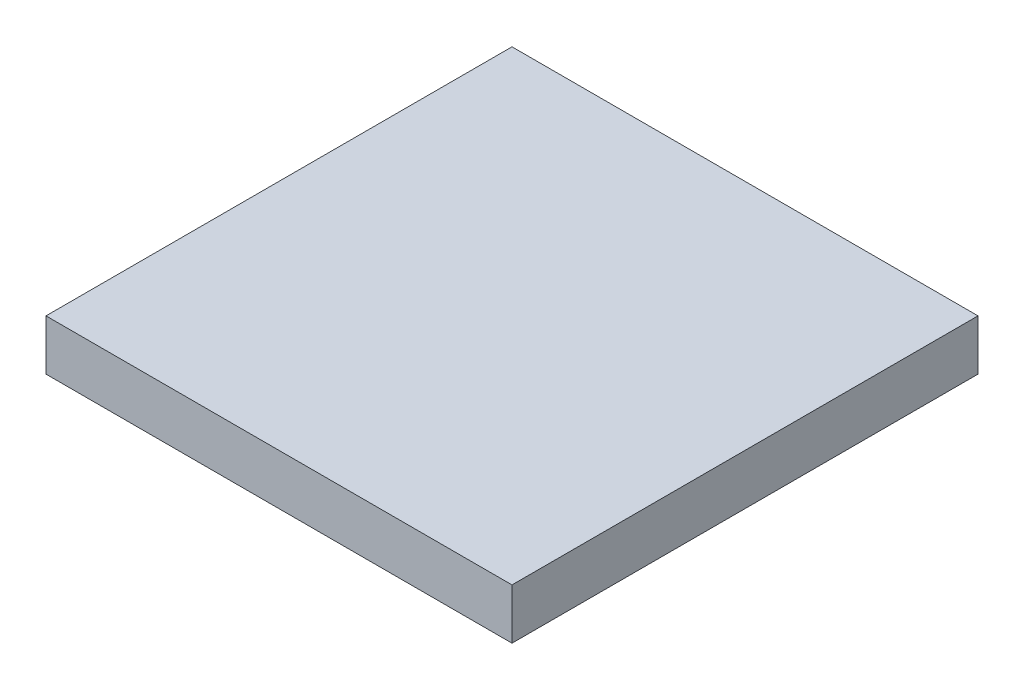
ISO-10303-21;
HEADER;
FILE_DESCRIPTION(('STEP AP214'),'2;1');
FILE_NAME('part.step','',(''),(''),'','','');
FILE_SCHEMA(('AUTOMOTIVE_DESIGN { 1 0 10303 214 1 1 1 1 }'));
ENDSEC;
DATA;
#1=APPLICATION_CONTEXT('core data for automotive mechanical design processes');
#2=APPLICATION_PROTOCOL_DEFINITION('international standard','automotive_design',2000,#1);
#3=PRODUCT_CONTEXT('',#1,'mechanical');
#4=PRODUCT('Part','Part','',(#3));
#5=PRODUCT_RELATED_PRODUCT_CATEGORY('part','',(#4));
#6=PRODUCT_DEFINITION_FORMATION('','',#4);
#7=PRODUCT_DEFINITION_CONTEXT('part definition',#1,'design');
#8=PRODUCT_DEFINITION('design','',#6,#7);
#9=PRODUCT_DEFINITION_SHAPE('','',#8);
#10=(LENGTH_UNIT() NAMED_UNIT(*) SI_UNIT(.MILLI.,.METRE.));
#11=(NAMED_UNIT(*) PLANE_ANGLE_UNIT() SI_UNIT($,.RADIAN.));
#12=(NAMED_UNIT(*) SI_UNIT($,.STERADIAN.) SOLID_ANGLE_UNIT());
#13=UNCERTAINTY_MEASURE_WITH_UNIT(LENGTH_MEASURE(1.E-05),#10,'distance_accuracy_value','');
#14=(GEOMETRIC_REPRESENTATION_CONTEXT(3) GLOBAL_UNCERTAINTY_ASSIGNED_CONTEXT((#13)) GLOBAL_UNIT_ASSIGNED_CONTEXT((#10,
#11,#12)) REPRESENTATION_CONTEXT('',''));
#15=CARTESIAN_POINT('',(0.,0.,0.));
#16=DIRECTION('',(0.,0.,1.));
#17=DIRECTION('',(1.,0.,0.));
#18=AXIS2_PLACEMENT_3D('',#15,#16,#17);
#19=CARTESIAN_POINT('',(0.,-25.,-30.));
#20=DIRECTION('',(-1.,0.,0.));
#21=DIRECTION('',(0.,0.,1.));
#22=AXIS2_PLACEMENT_3D('',#19,#20,#21);
#23=PLANE('',#22);
#24=DIRECTION('',(0.,-1.,0.));
#25=VECTOR('',#24,1.);
#26=CARTESIAN_POINT('',(0.,-25.,30.));
#27=LINE('',#26,#25);
#28=CARTESIAN_POINT('',(0.,-18.5,30.));
#29=VERTEX_POINT('',#28);
#30=CARTESIAN_POINT('',(0.,-25.,30.));
#31=VERTEX_POINT('',#30);
#32=EDGE_CURVE('E103',#29,#31,#27,.T.);
#33=ORIENTED_EDGE('',*,*,#32,.F.);
#34=DIRECTION('',(0.,0.,1.));
#35=VECTOR('',#34,1.);
#36=CARTESIAN_POINT('',(0.,-18.5,-30.));
#37=LINE('',#36,#35);
#38=CARTESIAN_POINT('',(0.,-18.5,-30.));
#39=VERTEX_POINT('',#38);
#40=EDGE_CURVE('E11',#39,#29,#37,.T.);
#41=ORIENTED_EDGE('',*,*,#40,.F.);
#42=DIRECTION('',(0.,-1.,0.));
#43=VECTOR('',#42,1.);
#44=CARTESIAN_POINT('',(0.,-25.,-30.));
#45=LINE('',#44,#43);
#46=CARTESIAN_POINT('',(0.,-25.,-30.));
#47=VERTEX_POINT('',#46);
#48=EDGE_CURVE('E97',#39,#47,#45,.T.);
#49=ORIENTED_EDGE('',*,*,#48,.T.);
#50=DIRECTION('',(0.,0.,1.));
#51=VECTOR('',#50,1.);
#52=CARTESIAN_POINT('',(0.,-25.,-30.));
#53=LINE('',#52,#51);
#54=EDGE_CURVE('E42',#47,#31,#53,.T.);
#55=ORIENTED_EDGE('',*,*,#54,.T.);
#56=EDGE_LOOP('',(#33,#41,#49,#55));
#57=FACE_BOUND('',#56,.T.);
#58=ADVANCED_FACE('F39',(#57),#23,.T.);
#59=CARTESIAN_POINT('',(0.,-18.5,-30.));
#60=DIRECTION('',(0.,1.,0.));
#61=DIRECTION('',(0.,0.,1.));
#62=AXIS2_PLACEMENT_3D('',#59,#60,#61);
#63=PLANE('',#62);
#64=DIRECTION('',(-1.,0.,0.));
#65=VECTOR('',#64,1.);
#66=CARTESIAN_POINT('',(0.,-18.5,30.));
#67=LINE('',#66,#65);
#68=CARTESIAN_POINT('',(60.,-18.5,30.));
#69=VERTEX_POINT('',#68);
#70=EDGE_CURVE('E99',#69,#29,#67,.T.);
#71=ORIENTED_EDGE('',*,*,#70,.F.);
#72=DIRECTION('',(0.,0.,1.));
#73=VECTOR('',#72,1.);
#74=CARTESIAN_POINT('',(60.,-18.5,-30.));
#75=LINE('',#74,#73);
#76=CARTESIAN_POINT('',(60.,-18.5,-30.));
#77=VERTEX_POINT('',#76);
#78=EDGE_CURVE('E48',#77,#69,#75,.T.);
#79=ORIENTED_EDGE('',*,*,#78,.F.);
#80=DIRECTION('',(-1.,0.,0.));
#81=VECTOR('',#80,1.);
#82=CARTESIAN_POINT('',(0.,-18.5,-30.));
#83=LINE('',#82,#81);
#84=EDGE_CURVE('E94',#77,#39,#83,.T.);
#85=ORIENTED_EDGE('',*,*,#84,.T.);
#86=ORIENTED_EDGE('',*,*,#40,.T.);
#87=EDGE_LOOP('',(#71,#79,#85,#86));
#88=FACE_BOUND('',#87,.T.);
#89=ADVANCED_FACE('F113',(#88),#63,.T.);
#90=CARTESIAN_POINT('',(60.,-25.,-30.));
#91=DIRECTION('',(1.,0.,0.));
#92=DIRECTION('',(0.,0.,-1.));
#93=AXIS2_PLACEMENT_3D('',#90,#91,#92);
#94=PLANE('',#93);
#95=DIRECTION('',(0.,1.,0.));
#96=VECTOR('',#95,1.);
#97=CARTESIAN_POINT('',(60.,-25.,30.));
#98=LINE('',#97,#96);
#99=CARTESIAN_POINT('',(60.,-25.,30.));
#100=VERTEX_POINT('',#99);
#101=EDGE_CURVE('E89',#100,#69,#98,.T.);
#102=ORIENTED_EDGE('',*,*,#101,.F.);
#103=DIRECTION('',(0.,0.,1.));
#104=VECTOR('',#103,1.);
#105=CARTESIAN_POINT('',(60.,-25.,-30.));
#106=LINE('',#105,#104);
#107=CARTESIAN_POINT('',(60.,-25.,-30.));
#108=VERTEX_POINT('',#107);
#109=EDGE_CURVE('E84',#108,#100,#106,.T.);
#110=ORIENTED_EDGE('',*,*,#109,.F.);
#111=DIRECTION('',(0.,1.,0.));
#112=VECTOR('',#111,1.);
#113=CARTESIAN_POINT('',(60.,-25.,-30.));
#114=LINE('',#113,#112);
#115=EDGE_CURVE('E87',#108,#77,#114,.T.);
#116=ORIENTED_EDGE('',*,*,#115,.T.);
#117=ORIENTED_EDGE('',*,*,#78,.T.);
#118=EDGE_LOOP('',(#102,#110,#116,#117));
#119=FACE_BOUND('',#118,.T.);
#120=ADVANCED_FACE('F86',(#119),#94,.T.);
#121=CARTESIAN_POINT('',(0.,-25.,-30.));
#122=DIRECTION('',(0.,-1.,0.));
#123=DIRECTION('',(0.,0.,-1.));
#124=AXIS2_PLACEMENT_3D('',#121,#122,#123);
#125=PLANE('',#124);
#126=DIRECTION('',(1.,0.,0.));
#127=VECTOR('',#126,1.);
#128=CARTESIAN_POINT('',(0.,-25.,30.));
#129=LINE('',#128,#127);
#130=EDGE_CURVE('E106',#31,#100,#129,.T.);
#131=ORIENTED_EDGE('',*,*,#130,.F.);
#132=ORIENTED_EDGE('',*,*,#54,.F.);
#133=DIRECTION('',(1.,0.,0.));
#134=VECTOR('',#133,1.);
#135=CARTESIAN_POINT('',(0.,-25.,-30.));
#136=LINE('',#135,#134);
#137=EDGE_CURVE('E93',#47,#108,#136,.T.);
#138=ORIENTED_EDGE('',*,*,#137,.T.);
#139=ORIENTED_EDGE('',*,*,#109,.T.);
#140=EDGE_LOOP('',(#131,#132,#138,#139));
#141=FACE_BOUND('',#140,.T.);
#142=ADVANCED_FACE('F96',(#141),#125,.T.);
#143=CARTESIAN_POINT('',(0.,0.,-30.));
#144=DIRECTION('',(0.,0.,-1.));
#145=DIRECTION('',(-1.,0.,0.));
#146=AXIS2_PLACEMENT_3D('',#143,#144,#145);
#147=PLANE('',#146);
#148=ORIENTED_EDGE('',*,*,#48,.F.);
#149=ORIENTED_EDGE('',*,*,#84,.F.);
#150=ORIENTED_EDGE('',*,*,#115,.F.);
#151=ORIENTED_EDGE('',*,*,#137,.F.);
#152=EDGE_LOOP('',(#148,#149,#150,#151));
#153=FACE_BOUND('',#152,.T.);
#154=ADVANCED_FACE('F92',(#153),#147,.T.);
#155=CARTESIAN_POINT('',(0.,0.,30.));
#156=DIRECTION('',(0.,0.,-1.));
#157=DIRECTION('',(-1.,0.,0.));
#158=AXIS2_PLACEMENT_3D('',#155,#156,#157);
#159=PLANE('',#158);
#160=ORIENTED_EDGE('',*,*,#32,.T.);
#161=ORIENTED_EDGE('',*,*,#130,.T.);
#162=ORIENTED_EDGE('',*,*,#101,.T.);
#163=ORIENTED_EDGE('',*,*,#70,.T.);
#164=EDGE_LOOP('',(#160,#161,#162,#163));
#165=FACE_BOUND('',#164,.T.);
#166=ADVANCED_FACE('F112',(#165),#159,.F.);
#167=CLOSED_SHELL('',(#58,#89,#120,#142,#154,#166));
#168=MANIFOLD_SOLID_BREP('B2',#167);
#169=ADVANCED_BREP_SHAPE_REPRESENTATION('',(#18,#168),#14);
#170=SHAPE_DEFINITION_REPRESENTATION(#9,#169);
ENDSEC;
END-ISO-10303-21;
